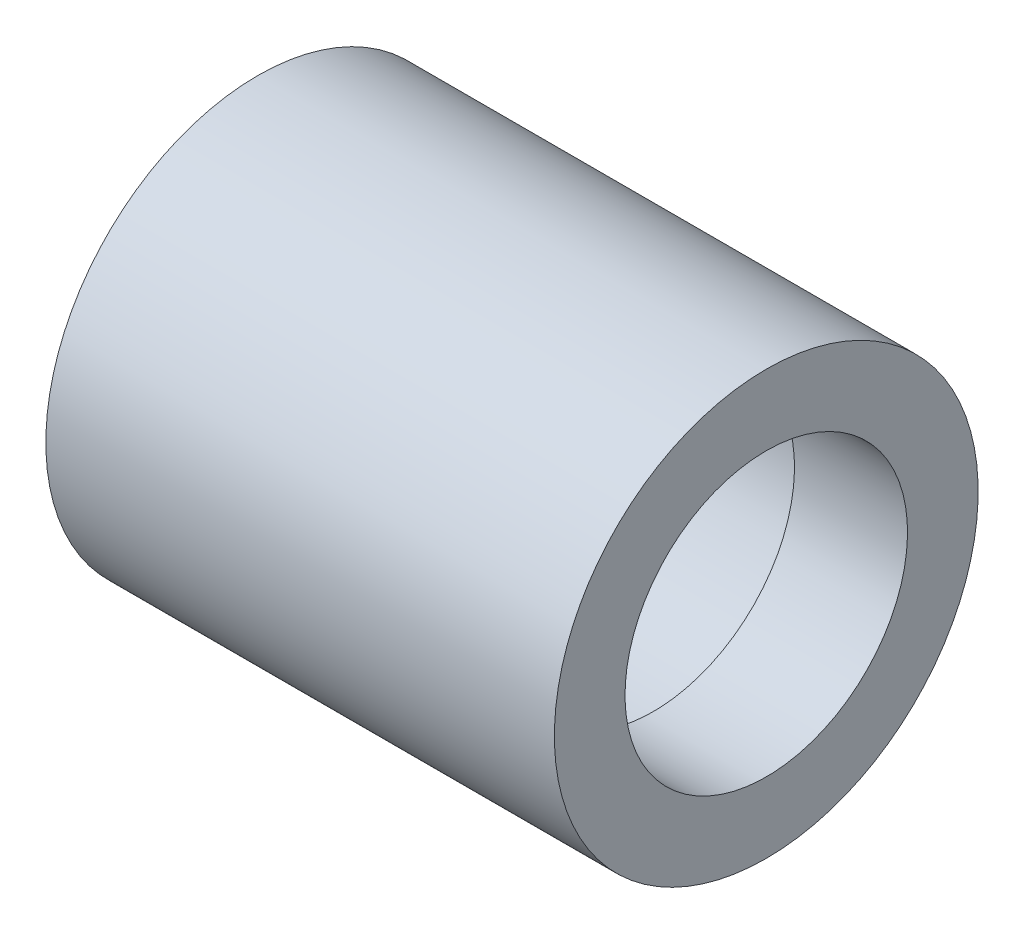
ISO-10303-21;
HEADER;
FILE_DESCRIPTION(('STEP AP214'),'2;1');
FILE_NAME('part.step','',(''),(''),'','','');
FILE_SCHEMA(('AUTOMOTIVE_DESIGN { 1 0 10303 214 1 1 1 1 }'));
ENDSEC;
DATA;
#1=APPLICATION_CONTEXT('core data for automotive mechanical design processes');
#2=APPLICATION_PROTOCOL_DEFINITION('international standard','automotive_design',2000,#1);
#3=PRODUCT_CONTEXT('',#1,'mechanical');
#4=PRODUCT('Part','Part','',(#3));
#5=PRODUCT_RELATED_PRODUCT_CATEGORY('part','',(#4));
#6=PRODUCT_DEFINITION_FORMATION('','',#4);
#7=PRODUCT_DEFINITION_CONTEXT('part definition',#1,'design');
#8=PRODUCT_DEFINITION('design','',#6,#7);
#9=PRODUCT_DEFINITION_SHAPE('','',#8);
#10=(LENGTH_UNIT() NAMED_UNIT(*) SI_UNIT(.MILLI.,.METRE.));
#11=(NAMED_UNIT(*) PLANE_ANGLE_UNIT() SI_UNIT($,.RADIAN.));
#12=(NAMED_UNIT(*) SI_UNIT($,.STERADIAN.) SOLID_ANGLE_UNIT());
#13=UNCERTAINTY_MEASURE_WITH_UNIT(LENGTH_MEASURE(1.E-05),#10,'distance_accuracy_value','');
#14=(GEOMETRIC_REPRESENTATION_CONTEXT(3) GLOBAL_UNCERTAINTY_ASSIGNED_CONTEXT((#13)) GLOBAL_UNIT_ASSIGNED_CONTEXT((#10,
#11,#12)) REPRESENTATION_CONTEXT('',''));
#15=CARTESIAN_POINT('',(0.,0.,0.));
#16=DIRECTION('',(0.,0.,1.));
#17=DIRECTION('',(1.,0.,0.));
#18=AXIS2_PLACEMENT_3D('',#15,#16,#17);
#19=CARTESIAN_POINT('',(17.,15.,0.));
#20=DIRECTION('',(1.,0.,0.));
#21=DIRECTION('',(0.,1.,0.));
#22=AXIS2_PLACEMENT_3D('',#19,#20,#21);
#23=PLANE('',#22);
#24=CARTESIAN_POINT('',(17.,0.,0.));
#25=DIRECTION('',(1.,0.,0.));
#26=DIRECTION('',(0.,1.,0.));
#27=AXIS2_PLACEMENT_3D('',#24,#25,#26);
#28=CIRCLE('',#27,15.);
#29=CARTESIAN_POINT('',(17.,15.,0.));
#30=VERTEX_POINT('',#29);
#31=EDGE_CURVE('E59',#30,#30,#28,.T.);
#32=ORIENTED_EDGE('',*,*,#31,.T.);
#33=EDGE_LOOP('',(#32));
#34=FACE_BOUND('',#33,.T.);
#35=CARTESIAN_POINT('',(17.,0.,0.));
#36=DIRECTION('',(1.,0.,0.));
#37=DIRECTION('',(0.,1.,0.));
#38=AXIS2_PLACEMENT_3D('',#35,#36,#37);
#39=CIRCLE('',#38,10.);
#40=CARTESIAN_POINT('',(17.,10.,0.));
#41=VERTEX_POINT('',#40);
#42=EDGE_CURVE('E10',#41,#41,#39,.T.);
#43=ORIENTED_EDGE('',*,*,#42,.F.);
#44=EDGE_LOOP('',(#43));
#45=FACE_BOUND('',#44,.T.);
#46=ADVANCED_FACE('F31',(#34,#45),#23,.T.);
#47=CARTESIAN_POINT('',(30.707544714558,0.,0.));
#48=DIRECTION('',(1.,0.,0.));
#49=DIRECTION('',(0.,1.,0.));
#50=AXIS2_PLACEMENT_3D('',#47,#48,#49);
#51=CYLINDRICAL_SURFACE('',#50,10.);
#52=ORIENTED_EDGE('',*,*,#42,.T.);
#53=EDGE_LOOP('',(#52));
#54=FACE_BOUND('',#53,.T.);
#55=CARTESIAN_POINT('',(9.,0.,0.));
#56=DIRECTION('',(1.,0.,0.));
#57=DIRECTION('',(0.,1.,0.));
#58=AXIS2_PLACEMENT_3D('',#55,#56,#57);
#59=CIRCLE('',#58,10.);
#60=CARTESIAN_POINT('',(9.,10.,0.));
#61=VERTEX_POINT('',#60);
#62=EDGE_CURVE('E37',#61,#61,#59,.T.);
#63=ORIENTED_EDGE('',*,*,#62,.F.);
#64=EDGE_LOOP('',(#63));
#65=FACE_BOUND('',#64,.T.);
#66=ADVANCED_FACE('F77',(#54,#65),#51,.F.);
#67=CARTESIAN_POINT('',(9.,10.,0.));
#68=DIRECTION('',(-1.,0.,0.));
#69=DIRECTION('',(0.,-1.,0.));
#70=AXIS2_PLACEMENT_3D('',#67,#68,#69);
#71=PLANE('',#70);
#72=ORIENTED_EDGE('',*,*,#62,.T.);
#73=EDGE_LOOP('',(#72));
#74=FACE_BOUND('',#73,.T.);
#75=CARTESIAN_POINT('',(9.,0.,0.));
#76=DIRECTION('',(1.,0.,0.));
#77=DIRECTION('',(0.,1.,0.));
#78=AXIS2_PLACEMENT_3D('',#75,#76,#77);
#79=CIRCLE('',#78,12.);
#80=CARTESIAN_POINT('',(9.,12.,0.));
#81=VERTEX_POINT('',#80);
#82=EDGE_CURVE('E41',#81,#81,#79,.T.);
#83=ORIENTED_EDGE('',*,*,#82,.F.);
#84=EDGE_LOOP('',(#83));
#85=FACE_BOUND('',#84,.T.);
#86=ADVANCED_FACE('F81',(#74,#85),#71,.T.);
#87=CARTESIAN_POINT('',(30.707544714558,0.,0.));
#88=DIRECTION('',(1.,0.,0.));
#89=DIRECTION('',(0.,1.,0.));
#90=AXIS2_PLACEMENT_3D('',#87,#88,#89);
#91=CYLINDRICAL_SURFACE('',#90,12.);
#92=ORIENTED_EDGE('',*,*,#82,.T.);
#93=EDGE_LOOP('',(#92));
#94=FACE_BOUND('',#93,.T.);
#95=CARTESIAN_POINT('',(-8.99999999999999,0.,0.));
#96=DIRECTION('',(1.,0.,0.));
#97=DIRECTION('',(0.,1.,0.));
#98=AXIS2_PLACEMENT_3D('',#95,#96,#97);
#99=CIRCLE('',#98,12.);
#100=CARTESIAN_POINT('',(-9.,12.,0.));
#101=VERTEX_POINT('',#100);
#102=EDGE_CURVE('E45',#101,#101,#99,.T.);
#103=ORIENTED_EDGE('',*,*,#102,.F.);
#104=EDGE_LOOP('',(#103));
#105=FACE_BOUND('',#104,.T.);
#106=ADVANCED_FACE('F85',(#94,#105),#91,.F.);
#107=CARTESIAN_POINT('',(-9.,12.,0.));
#108=DIRECTION('',(1.,0.,0.));
#109=DIRECTION('',(0.,1.,0.));
#110=AXIS2_PLACEMENT_3D('',#107,#108,#109);
#111=PLANE('',#110);
#112=ORIENTED_EDGE('',*,*,#102,.T.);
#113=EDGE_LOOP('',(#112));
#114=FACE_BOUND('',#113,.T.);
#115=CARTESIAN_POINT('',(-8.99999999999999,0.,0.));
#116=DIRECTION('',(1.,0.,0.));
#117=DIRECTION('',(0.,1.,0.));
#118=AXIS2_PLACEMENT_3D('',#115,#116,#117);
#119=CIRCLE('',#118,10.);
#120=CARTESIAN_POINT('',(-9.,10.,0.));
#121=VERTEX_POINT('',#120);
#122=EDGE_CURVE('E50',#121,#121,#119,.T.);
#123=ORIENTED_EDGE('',*,*,#122,.F.);
#124=EDGE_LOOP('',(#123));
#125=FACE_BOUND('',#124,.T.);
#126=ADVANCED_FACE('F91',(#114,#125),#111,.T.);
#127=CARTESIAN_POINT('',(30.707544714558,0.,0.));
#128=DIRECTION('',(1.,0.,0.));
#129=DIRECTION('',(0.,1.,0.));
#130=AXIS2_PLACEMENT_3D('',#127,#128,#129);
#131=CYLINDRICAL_SURFACE('',#130,10.);
#132=ORIENTED_EDGE('',*,*,#122,.T.);
#133=EDGE_LOOP('',(#132));
#134=FACE_BOUND('',#133,.T.);
#135=CARTESIAN_POINT('',(-19.,0.,0.));
#136=DIRECTION('',(1.,0.,0.));
#137=DIRECTION('',(0.,1.,0.));
#138=AXIS2_PLACEMENT_3D('',#135,#136,#137);
#139=CIRCLE('',#138,10.);
#140=CARTESIAN_POINT('',(-19.,10.,0.));
#141=VERTEX_POINT('',#140);
#142=EDGE_CURVE('E53',#141,#141,#139,.T.);
#143=ORIENTED_EDGE('',*,*,#142,.F.);
#144=EDGE_LOOP('',(#143));
#145=FACE_BOUND('',#144,.T.);
#146=ADVANCED_FACE('F73',(#134,#145),#131,.F.);
#147=CARTESIAN_POINT('',(-19.,15.,0.));
#148=DIRECTION('',(-1.,0.,0.));
#149=DIRECTION('',(0.,-1.,0.));
#150=AXIS2_PLACEMENT_3D('',#147,#148,#149);
#151=PLANE('',#150);
#152=ORIENTED_EDGE('',*,*,#142,.T.);
#153=EDGE_LOOP('',(#152));
#154=FACE_BOUND('',#153,.T.);
#155=CARTESIAN_POINT('',(-19.,0.,0.));
#156=DIRECTION('',(1.,0.,0.));
#157=DIRECTION('',(0.,1.,0.));
#158=AXIS2_PLACEMENT_3D('',#155,#156,#157);
#159=CIRCLE('',#158,15.);
#160=CARTESIAN_POINT('',(-19.,15.,0.));
#161=VERTEX_POINT('',#160);
#162=EDGE_CURVE('E56',#161,#161,#159,.T.);
#163=ORIENTED_EDGE('',*,*,#162,.F.);
#164=EDGE_LOOP('',(#163));
#165=FACE_BOUND('',#164,.T.);
#166=ADVANCED_FACE('F67',(#154,#165),#151,.T.);
#167=CARTESIAN_POINT('',(30.707544714558,0.,0.));
#168=DIRECTION('',(1.,0.,0.));
#169=DIRECTION('',(0.,1.,0.));
#170=AXIS2_PLACEMENT_3D('',#167,#168,#169);
#171=CYLINDRICAL_SURFACE('',#170,15.);
#172=ORIENTED_EDGE('',*,*,#162,.T.);
#173=EDGE_LOOP('',(#172));
#174=FACE_BOUND('',#173,.T.);
#175=ORIENTED_EDGE('',*,*,#31,.F.);
#176=EDGE_LOOP('',(#175));
#177=FACE_BOUND('',#176,.T.);
#178=ADVANCED_FACE('F65',(#174,#177),#171,.T.);
#179=CLOSED_SHELL('',(#46,#66,#86,#106,#126,#146,#166,#178));
#180=MANIFOLD_SOLID_BREP('B2',#179);
#181=ADVANCED_BREP_SHAPE_REPRESENTATION('',(#18,#180),#14);
#182=SHAPE_DEFINITION_REPRESENTATION(#9,#181);
ENDSEC;
END-ISO-10303-21;
